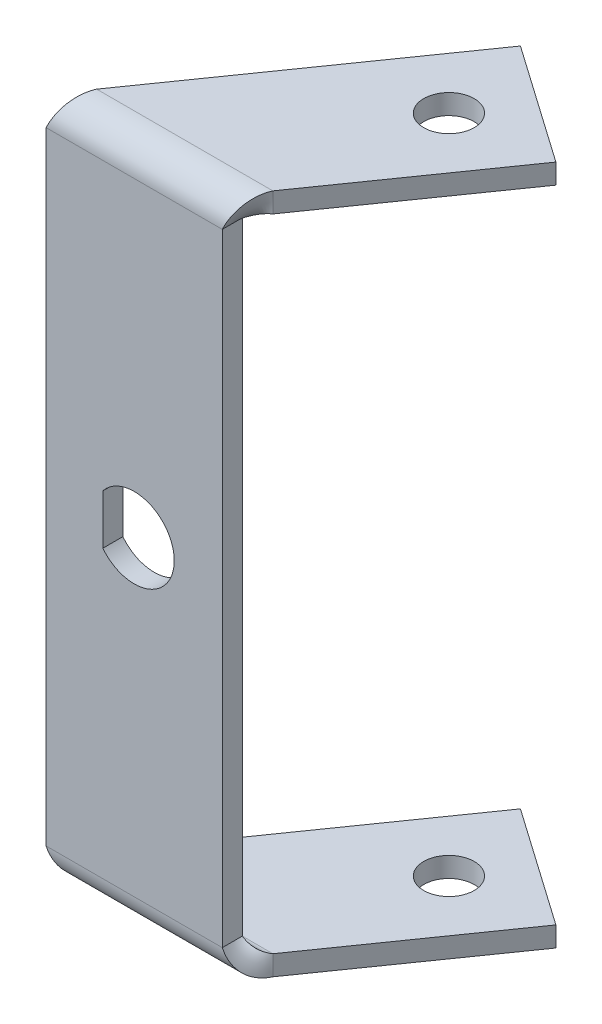
ISO-10303-21;
HEADER;
FILE_DESCRIPTION(('STEP AP214'),'2;1');
FILE_NAME('part.step','',(''),(''),'','','');
FILE_SCHEMA(('AUTOMOTIVE_DESIGN { 1 0 10303 214 1 1 1 1 }'));
ENDSEC;
DATA;
#1=APPLICATION_CONTEXT('core data for automotive mechanical design processes');
#2=APPLICATION_PROTOCOL_DEFINITION('international standard','automotive_design',2000,#1);
#3=PRODUCT_CONTEXT('',#1,'mechanical');
#4=PRODUCT('Part','Part','',(#3));
#5=PRODUCT_RELATED_PRODUCT_CATEGORY('part','',(#4));
#6=PRODUCT_DEFINITION_FORMATION('','',#4);
#7=PRODUCT_DEFINITION_CONTEXT('part definition',#1,'design');
#8=PRODUCT_DEFINITION('design','',#6,#7);
#9=PRODUCT_DEFINITION_SHAPE('','',#8);
#10=(LENGTH_UNIT() NAMED_UNIT(*) SI_UNIT(.MILLI.,.METRE.));
#11=(NAMED_UNIT(*) PLANE_ANGLE_UNIT() SI_UNIT($,.RADIAN.));
#12=(NAMED_UNIT(*) SI_UNIT($,.STERADIAN.) SOLID_ANGLE_UNIT());
#13=UNCERTAINTY_MEASURE_WITH_UNIT(LENGTH_MEASURE(1.E-05),#10,'distance_accuracy_value','');
#14=(GEOMETRIC_REPRESENTATION_CONTEXT(3) GLOBAL_UNCERTAINTY_ASSIGNED_CONTEXT((#13)) GLOBAL_UNIT_ASSIGNED_CONTEXT((#10,
#11,#12)) REPRESENTATION_CONTEXT('',''));
#15=CARTESIAN_POINT('',(0.,0.,0.));
#16=DIRECTION('',(0.,0.,1.));
#17=DIRECTION('',(1.,0.,0.));
#18=AXIS2_PLACEMENT_3D('',#15,#16,#17);
#19=CARTESIAN_POINT('',(0.,0.,-1.5875));
#20=DIRECTION('',(0.,0.,1.));
#21=DIRECTION('',(1.,0.,0.));
#22=AXIS2_PLACEMENT_3D('',#19,#20,#21);
#23=PLANE('',#22);
#24=DIRECTION('',(0.,-1.,0.));
#25=VECTOR('',#24,1.);
#26=CARTESIAN_POINT('',(-2.4892,-1.97091561463194,-1.5875));
#27=LINE('',#26,#25);
#28=CARTESIAN_POINT('',(-2.4892,1.97091561463194,-1.5875));
#29=VERTEX_POINT('',#28);
#30=CARTESIAN_POINT('',(-2.4892,-1.97091561463194,-1.5875));
#31=VERTEX_POINT('',#30);
#32=EDGE_CURVE('E441',#29,#31,#27,.T.);
#33=ORIENTED_EDGE('',*,*,#32,.T.);
#34=CARTESIAN_POINT('',(0.,0.,-1.5875));
#35=DIRECTION('',(0.,0.,1.));
#36=DIRECTION('',(1.,0.,0.));
#37=AXIS2_PLACEMENT_3D('',#34,#35,#36);
#38=CIRCLE('',#37,3.175);
#39=EDGE_CURVE('E432',#31,#29,#38,.T.);
#40=ORIENTED_EDGE('',*,*,#39,.T.);
#41=EDGE_LOOP('',(#33,#40));
#42=FACE_BOUND('',#41,.T.);
#43=DIRECTION('',(0.,1.,0.));
#44=VECTOR('',#43,1.);
#45=CARTESIAN_POINT('',(6.985,24.6634,-1.5875));
#46=LINE('',#45,#44);
#47=CARTESIAN_POINT('',(6.985,-24.6634,-1.5875));
#48=VERTEX_POINT('',#47);
#49=CARTESIAN_POINT('',(6.985,24.6634,-1.5875));
#50=VERTEX_POINT('',#49);
#51=EDGE_CURVE('E440',#48,#50,#46,.T.);
#52=ORIENTED_EDGE('',*,*,#51,.F.);
#53=DIRECTION('',(-1.,0.,0.));
#54=VECTOR('',#53,1.);
#55=CARTESIAN_POINT('',(0.,-24.6634,-1.5875));
#56=LINE('',#55,#54);
#57=CARTESIAN_POINT('',(-6.985,-24.6634,-1.5875));
#58=VERTEX_POINT('',#57);
#59=EDGE_CURVE('E578',#48,#58,#56,.T.);
#60=ORIENTED_EDGE('',*,*,#59,.T.);
#61=DIRECTION('',(0.,-1.,0.));
#62=VECTOR('',#61,1.);
#63=CARTESIAN_POINT('',(-6.985,24.6634,-1.5875));
#64=LINE('',#63,#62);
#65=CARTESIAN_POINT('',(-6.985,24.6634,-1.5875));
#66=VERTEX_POINT('',#65);
#67=EDGE_CURVE('E663',#66,#58,#64,.T.);
#68=ORIENTED_EDGE('',*,*,#67,.F.);
#69=DIRECTION('',(-1.,0.,0.));
#70=VECTOR('',#69,1.);
#71=CARTESIAN_POINT('',(0.,24.6634,-1.5875));
#72=LINE('',#71,#70);
#73=EDGE_CURVE('E474',#50,#66,#72,.T.);
#74=ORIENTED_EDGE('',*,*,#73,.F.);
#75=EDGE_LOOP('',(#52,#60,#68,#74));
#76=FACE_BOUND('',#75,.T.);
#77=ADVANCED_FACE('F73',(#42,#76),#23,.F.);
#78=CARTESIAN_POINT('',(0.,25.4000000000001,24.7431681587106));
#79=DIRECTION('',(0.,1.,0.));
#80=DIRECTION('',(1.,0.,0.));
#81=AXIS2_PLACEMENT_3D('',#78,#79,#80);
#82=PLANE('',#81);
#83=CARTESIAN_POINT('',(10.3108574652591,25.4,-14.6456623781015));
#84=DIRECTION('',(0.,1.,0.));
#85=DIRECTION('',(1.,0.,0.));
#86=AXIS2_PLACEMENT_3D('',#83,#84,#85);
#87=CIRCLE('',#86,2.);
#88=CARTESIAN_POINT('',(12.3108574652591,25.4,-14.6456623781015));
#89=VERTEX_POINT('',#88);
#90=EDGE_CURVE('E613',#89,#89,#87,.T.);
#91=ORIENTED_EDGE('',*,*,#90,.T.);
#92=EDGE_LOOP('',(#91));
#93=FACE_BOUND('',#92,.T.);
#94=DIRECTION('',(0.573576436351042,0.,-0.819152044288995));
#95=VECTOR('',#94,1.);
#96=CARTESIAN_POINT('',(6.985,25.4,0.0797681587105803));
#97=LINE('',#96,#95);
#98=CARTESIAN_POINT('',(8.66820660559142,25.4,-2.32410000000001));
#99=VERTEX_POINT('',#98);
#100=CARTESIAN_POINT('',(17.9116311124873,25.4,-15.5250782849948));
#101=VERTEX_POINT('',#100);
#102=EDGE_CURVE('E602',#99,#101,#97,.T.);
#103=ORIENTED_EDGE('',*,*,#102,.F.);
#104=DIRECTION('',(-1.,0.,0.));
#105=VECTOR('',#104,1.);
#106=CARTESIAN_POINT('',(0.,25.4,-2.3241));
#107=LINE('',#106,#105);
#108=CARTESIAN_POINT('',(-5.30179339440858,25.4,-2.3241));
#109=VERTEX_POINT('',#108);
#110=EDGE_CURVE('E593',#99,#109,#107,.T.);
#111=ORIENTED_EDGE('',*,*,#110,.T.);
#112=DIRECTION('',(-0.573576436351041,0.,0.819152044288995));
#113=VECTOR('',#112,1.);
#114=CARTESIAN_POINT('',(8.53762041135746,25.3999999999999,-22.0888312411843));
#115=LINE('',#114,#113);
#116=CARTESIAN_POINT('',(8.53762041135746,25.3999999999999,-22.0888312411843));
#117=VERTEX_POINT('',#116);
#118=EDGE_CURVE('E622',#117,#109,#115,.T.);
#119=ORIENTED_EDGE('',*,*,#118,.F.);
#120=DIRECTION('',(-0.819152044288995,0.,-0.573576436351042));
#121=VECTOR('',#120,1.);
#122=CARTESIAN_POINT('',(17.9116311124873,25.4,-15.5250782849948));
#123=LINE('',#122,#121);
#124=EDGE_CURVE('E608',#101,#117,#123,.T.);
#125=ORIENTED_EDGE('',*,*,#124,.F.);
#126=EDGE_LOOP('',(#103,#111,#119,#125));
#127=FACE_BOUND('',#126,.T.);
#128=ADVANCED_FACE('F539',(#93,#127),#82,.F.);
#129=CARTESIAN_POINT('',(8.53762041135746,25.3999999999999,-22.0888312411843));
#130=DIRECTION('',(-0.819152044288995,0.,-0.573576436351041));
#131=DIRECTION('',(-0.573576436351041,0.,0.819152044288995));
#132=AXIS2_PLACEMENT_3D('',#129,#130,#131);
#133=PLANE('',#132);
#134=CARTESIAN_POINT('',(-5.30179339440858,26.9875,-2.32410000000001));
#135=CARTESIAN_POINT('',(-5.30179339440858,25.4,-2.3241));
#136=B_SPLINE_CURVE_WITH_KNOTS('',1,(#134,#135),.UNSPECIFIED.,.F.,.F.,(2,2),(0.,1.),.UNSPECIFIED.);
#137=CARTESIAN_POINT('',(-5.30179339440858,26.9875,-2.32410000000002));
#138=VERTEX_POINT('',#137);
#139=EDGE_CURVE('E585',#138,#109,#136,.T.);
#140=ORIENTED_EDGE('',*,*,#139,.F.);
#141=DIRECTION('',(-0.573576436351041,0.,0.819152044288995));
#142=VECTOR('',#141,1.);
#143=CARTESIAN_POINT('',(8.53762041135746,26.9874999999999,-22.0888312411843));
#144=LINE('',#143,#142);
#145=CARTESIAN_POINT('',(8.53762041135746,26.9874999999999,-22.0888312411843));
#146=VERTEX_POINT('',#145);
#147=EDGE_CURVE('E600',#146,#138,#144,.T.);
#148=ORIENTED_EDGE('',*,*,#147,.F.);
#149=DIRECTION('',(0.,1.,0.));
#150=VECTOR('',#149,1.);
#151=CARTESIAN_POINT('',(8.53762041135746,25.3999999999999,-22.0888312411843));
#152=LINE('',#151,#150);
#153=EDGE_CURVE('E617',#117,#146,#152,.T.);
#154=ORIENTED_EDGE('',*,*,#153,.F.);
#155=ORIENTED_EDGE('',*,*,#118,.T.);
#156=EDGE_LOOP('',(#140,#148,#154,#155));
#157=FACE_BOUND('',#156,.T.);
#158=ADVANCED_FACE('F544',(#157),#133,.T.);
#159=CARTESIAN_POINT('',(17.9116311124873,25.4,-15.5250782849948));
#160=DIRECTION('',(0.573576436351042,0.,-0.819152044288995));
#161=DIRECTION('',(-0.819152044288995,0.,-0.573576436351042));
#162=AXIS2_PLACEMENT_3D('',#159,#160,#161);
#163=PLANE('',#162);
#164=DIRECTION('',(-0.819152044288995,0.,-0.573576436351042));
#165=VECTOR('',#164,1.);
#166=CARTESIAN_POINT('',(17.9116311124873,26.9875,-15.5250782849948));
#167=LINE('',#166,#165);
#168=CARTESIAN_POINT('',(17.9116311124873,26.9875,-15.5250782849948));
#169=VERTEX_POINT('',#168);
#170=EDGE_CURVE('E603',#169,#146,#167,.T.);
#171=ORIENTED_EDGE('',*,*,#170,.F.);
#172=DIRECTION('',(0.,1.,0.));
#173=VECTOR('',#172,1.);
#174=CARTESIAN_POINT('',(17.9116311124873,25.4,-15.5250782849948));
#175=LINE('',#174,#173);
#176=EDGE_CURVE('E619',#101,#169,#175,.T.);
#177=ORIENTED_EDGE('',*,*,#176,.F.);
#178=ORIENTED_EDGE('',*,*,#124,.T.);
#179=ORIENTED_EDGE('',*,*,#153,.T.);
#180=EDGE_LOOP('',(#171,#177,#178,#179));
#181=FACE_BOUND('',#180,.T.);
#182=ADVANCED_FACE('F552',(#181),#163,.T.);
#183=CARTESIAN_POINT('',(6.985,25.4,0.0797681587105803));
#184=DIRECTION('',(0.819152044288995,0.,0.573576436351042));
#185=DIRECTION('',(0.573576436351042,0.,-0.819152044288995));
#186=AXIS2_PLACEMENT_3D('',#183,#184,#185);
#187=PLANE('',#186);
#188=CARTESIAN_POINT('',(8.66820660559142,25.4,-2.32410000000001));
#189=CARTESIAN_POINT('',(8.66820660559142,26.9875,-2.32410000000002));
#190=B_SPLINE_CURVE_WITH_KNOTS('',1,(#188,#189),.UNSPECIFIED.,.F.,.F.,(2,2),(0.,1.),.UNSPECIFIED.);
#191=CARTESIAN_POINT('',(8.66820660559142,26.9875,-2.32410000000002));
#192=VERTEX_POINT('',#191);
#193=EDGE_CURVE('E590',#99,#192,#190,.T.);
#194=ORIENTED_EDGE('',*,*,#193,.F.);
#195=ORIENTED_EDGE('',*,*,#102,.T.);
#196=ORIENTED_EDGE('',*,*,#176,.T.);
#197=DIRECTION('',(0.573576436351042,0.,-0.819152044288995));
#198=VECTOR('',#197,1.);
#199=CARTESIAN_POINT('',(6.985,26.9875,0.0797681587105734));
#200=LINE('',#199,#198);
#201=EDGE_CURVE('E610',#192,#169,#200,.T.);
#202=ORIENTED_EDGE('',*,*,#201,.F.);
#203=EDGE_LOOP('',(#194,#195,#196,#202));
#204=FACE_BOUND('',#203,.T.);
#205=ADVANCED_FACE('F637',(#204),#187,.T.);
#206=CARTESIAN_POINT('',(0.,26.9875000000001,24.7431681587106));
#207=DIRECTION('',(0.,1.,0.));
#208=DIRECTION('',(1.,0.,0.));
#209=AXIS2_PLACEMENT_3D('',#206,#207,#208);
#210=PLANE('',#209);
#211=DIRECTION('',(-1.,0.,0.));
#212=VECTOR('',#211,1.);
#213=CARTESIAN_POINT('',(0.,26.9875,-2.3241));
#214=LINE('',#213,#212);
#215=EDGE_CURVE('E588',#192,#138,#214,.T.);
#216=ORIENTED_EDGE('',*,*,#215,.F.);
#217=ORIENTED_EDGE('',*,*,#201,.T.);
#218=ORIENTED_EDGE('',*,*,#170,.T.);
#219=ORIENTED_EDGE('',*,*,#147,.T.);
#220=EDGE_LOOP('',(#216,#217,#218,#219));
#221=FACE_BOUND('',#220,.T.);
#222=CARTESIAN_POINT('',(10.3108574652591,26.9875,-14.6456623781015));
#223=DIRECTION('',(0.,1.,0.));
#224=DIRECTION('',(1.,0.,0.));
#225=AXIS2_PLACEMENT_3D('',#222,#223,#224);
#226=CIRCLE('',#225,2.);
#227=CARTESIAN_POINT('',(12.3108574652591,26.9875,-14.6456623781015));
#228=VERTEX_POINT('',#227);
#229=EDGE_CURVE('E661',#228,#228,#226,.T.);
#230=ORIENTED_EDGE('',*,*,#229,.F.);
#231=EDGE_LOOP('',(#230));
#232=FACE_BOUND('',#231,.T.);
#233=ADVANCED_FACE('F554',(#221,#232),#210,.T.);
#234=CARTESIAN_POINT('',(10.3108574652591,25.4,-14.6456623781015));
#235=DIRECTION('',(0.,1.,0.));
#236=DIRECTION('',(1.,0.,0.));
#237=AXIS2_PLACEMENT_3D('',#234,#235,#236);
#238=CYLINDRICAL_SURFACE('',#237,2.);
#239=ORIENTED_EDGE('',*,*,#90,.F.);
#240=EDGE_LOOP('',(#239));
#241=FACE_BOUND('',#240,.T.);
#242=ORIENTED_EDGE('',*,*,#229,.T.);
#243=EDGE_LOOP('',(#242));
#244=FACE_BOUND('',#243,.T.);
#245=ADVANCED_FACE('F648',(#241,#244),#238,.F.);
#246=CARTESIAN_POINT('',(0.,0.,-1.5875));
#247=DIRECTION('',(0.,0.,1.));
#248=DIRECTION('',(1.,0.,0.));
#249=AXIS2_PLACEMENT_3D('',#246,#247,#248);
#250=CYLINDRICAL_SURFACE('',#249,3.175);
#251=CARTESIAN_POINT('',(0.,0.,0.));
#252=DIRECTION('',(0.,0.,1.));
#253=DIRECTION('',(1.,0.,0.));
#254=AXIS2_PLACEMENT_3D('',#251,#252,#253);
#255=CIRCLE('',#254,3.175);
#256=CARTESIAN_POINT('',(-2.4892,-1.97091561463194,0.));
#257=VERTEX_POINT('',#256);
#258=CARTESIAN_POINT('',(-2.4892,1.97091561463194,0.));
#259=VERTEX_POINT('',#258);
#260=EDGE_CURVE('E452',#257,#259,#255,.T.);
#261=ORIENTED_EDGE('',*,*,#260,.T.);
#262=DIRECTION('',(0.,0.,1.));
#263=VECTOR('',#262,1.);
#264=CARTESIAN_POINT('',(-2.4892,1.97091561463194,-1.5875));
#265=LINE('',#264,#263);
#266=EDGE_CURVE('E444',#29,#259,#265,.T.);
#267=ORIENTED_EDGE('',*,*,#266,.F.);
#268=ORIENTED_EDGE('',*,*,#39,.F.);
#269=DIRECTION('',(0.,0.,1.));
#270=VECTOR('',#269,1.);
#271=CARTESIAN_POINT('',(-2.4892,-1.97091561463194,-1.5875));
#272=LINE('',#271,#270);
#273=EDGE_CURVE('E450',#31,#257,#272,.T.);
#274=ORIENTED_EDGE('',*,*,#273,.T.);
#275=EDGE_LOOP('',(#261,#267,#268,#274));
#276=FACE_BOUND('',#275,.T.);
#277=ADVANCED_FACE('F402',(#276),#250,.F.);
#278=CARTESIAN_POINT('',(-2.4892,-1.97091561463194,-1.5875));
#279=DIRECTION('',(-1.,0.,0.));
#280=DIRECTION('',(0.,0.,1.));
#281=AXIS2_PLACEMENT_3D('',#278,#279,#280);
#282=PLANE('',#281);
#283=DIRECTION('',(0.,-1.,0.));
#284=VECTOR('',#283,1.);
#285=CARTESIAN_POINT('',(-2.4892,-1.97091561463194,0.));
#286=LINE('',#285,#284);
#287=EDGE_CURVE('E447',#259,#257,#286,.T.);
#288=ORIENTED_EDGE('',*,*,#287,.T.);
#289=ORIENTED_EDGE('',*,*,#273,.F.);
#290=ORIENTED_EDGE('',*,*,#32,.F.);
#291=ORIENTED_EDGE('',*,*,#266,.T.);
#292=EDGE_LOOP('',(#288,#289,#290,#291));
#293=FACE_BOUND('',#292,.T.);
#294=ADVANCED_FACE('F485',(#293),#282,.F.);
#295=CARTESIAN_POINT('',(6.985,24.6634,-1.5875));
#296=DIRECTION('',(1.,0.,0.));
#297=DIRECTION('',(0.,1.,0.));
#298=AXIS2_PLACEMENT_3D('',#295,#296,#297);
#299=PLANE('',#298);
#300=DIRECTION('',(0.,1.,0.));
#301=VECTOR('',#300,1.);
#302=CARTESIAN_POINT('',(6.985,24.6634,0.));
#303=LINE('',#302,#301);
#304=CARTESIAN_POINT('',(6.985,-24.6634,0.));
#305=VERTEX_POINT('',#304);
#306=CARTESIAN_POINT('',(6.985,24.6634,0.));
#307=VERTEX_POINT('',#306);
#308=EDGE_CURVE('E458',#305,#307,#303,.T.);
#309=ORIENTED_EDGE('',*,*,#308,.F.);
#310=CARTESIAN_POINT('',(6.985,-24.6634,-1.5875));
#311=CARTESIAN_POINT('',(6.985,-24.6634,0.));
#312=B_SPLINE_CURVE_WITH_KNOTS('',1,(#310,#311),.UNSPECIFIED.,.F.,.F.,(2,2),(0.,1.),.UNSPECIFIED.);
#313=EDGE_CURVE('E315',#48,#305,#312,.T.);
#314=ORIENTED_EDGE('',*,*,#313,.F.);
#315=ORIENTED_EDGE('',*,*,#51,.T.);
#316=CARTESIAN_POINT('',(6.985,24.6634,0.));
#317=CARTESIAN_POINT('',(6.985,24.6634,-1.5875));
#318=B_SPLINE_CURVE_WITH_KNOTS('',1,(#316,#317),.UNSPECIFIED.,.F.,.F.,(2,2),(0.,1.),.UNSPECIFIED.);
#319=EDGE_CURVE('E463',#50,#307,#318,.F.);
#320=ORIENTED_EDGE('',*,*,#319,.T.);
#321=EDGE_LOOP('',(#309,#314,#315,#320));
#322=FACE_BOUND('',#321,.T.);
#323=ADVANCED_FACE('F476',(#322),#299,.T.);
#324=CARTESIAN_POINT('',(0.,0.,0.));
#325=DIRECTION('',(0.,0.,1.));
#326=DIRECTION('',(1.,0.,0.));
#327=AXIS2_PLACEMENT_3D('',#324,#325,#326);
#328=PLANE('',#327);
#329=DIRECTION('',(-1.,0.,0.));
#330=VECTOR('',#329,1.);
#331=CARTESIAN_POINT('',(0.,-24.6634,0.));
#332=LINE('',#331,#330);
#333=CARTESIAN_POINT('',(-6.985,-24.6634,0.));
#334=VERTEX_POINT('',#333);
#335=EDGE_CURVE('E84',#305,#334,#332,.T.);
#336=ORIENTED_EDGE('',*,*,#335,.F.);
#337=ORIENTED_EDGE('',*,*,#308,.T.);
#338=DIRECTION('',(-1.,0.,0.));
#339=VECTOR('',#338,1.);
#340=CARTESIAN_POINT('',(0.,24.6634,0.));
#341=LINE('',#340,#339);
#342=CARTESIAN_POINT('',(-6.985,24.6634,0.));
#343=VERTEX_POINT('',#342);
#344=EDGE_CURVE('E454',#307,#343,#341,.T.);
#345=ORIENTED_EDGE('',*,*,#344,.T.);
#346=DIRECTION('',(0.,-1.,0.));
#347=VECTOR('',#346,1.);
#348=CARTESIAN_POINT('',(-6.985,24.6634,0.));
#349=LINE('',#348,#347);
#350=EDGE_CURVE('E457',#343,#334,#349,.T.);
#351=ORIENTED_EDGE('',*,*,#350,.T.);
#352=EDGE_LOOP('',(#336,#337,#345,#351));
#353=FACE_BOUND('',#352,.T.);
#354=ORIENTED_EDGE('',*,*,#260,.F.);
#355=ORIENTED_EDGE('',*,*,#287,.F.);
#356=EDGE_LOOP('',(#354,#355));
#357=FACE_BOUND('',#356,.T.);
#358=ADVANCED_FACE('F75',(#353,#357),#328,.T.);
#359=CARTESIAN_POINT('',(-6.985,24.6634,-1.5875));
#360=DIRECTION('',(-1.,0.,0.));
#361=DIRECTION('',(0.,-1.,0.));
#362=AXIS2_PLACEMENT_3D('',#359,#360,#361);
#363=PLANE('',#362);
#364=ORIENTED_EDGE('',*,*,#350,.F.);
#365=CARTESIAN_POINT('',(-6.985,24.6634,-1.5875));
#366=CARTESIAN_POINT('',(-6.985,24.6634,0.));
#367=B_SPLINE_CURVE_WITH_KNOTS('',1,(#365,#366),.UNSPECIFIED.,.F.,.F.,(2,2),(0.,1.),.UNSPECIFIED.);
#368=EDGE_CURVE('E428',#66,#343,#367,.T.);
#369=ORIENTED_EDGE('',*,*,#368,.F.);
#370=ORIENTED_EDGE('',*,*,#67,.T.);
#371=CARTESIAN_POINT('',(-6.985,-24.6634,0.));
#372=CARTESIAN_POINT('',(-6.985,-24.6634,-1.5875));
#373=B_SPLINE_CURVE_WITH_KNOTS('',1,(#371,#372),.UNSPECIFIED.,.F.,.F.,(2,2),(0.,1.),.UNSPECIFIED.);
#374=EDGE_CURVE('E12',#58,#334,#373,.F.);
#375=ORIENTED_EDGE('',*,*,#374,.T.);
#376=EDGE_LOOP('',(#364,#369,#370,#375));
#377=FACE_BOUND('',#376,.T.);
#378=ADVANCED_FACE('F486',(#377),#363,.T.);
#379=CARTESIAN_POINT('',(8.66820660559142,26.9875,-2.32410000000002));
#380=CARTESIAN_POINT('',(8.52791853229599,26.9875,-2.0198307867127));
#381=CARTESIAN_POINT('',(8.38767217132618,26.9270098978449,-1.71577174196061));
#382=CARTESIAN_POINT('',(8.10713773706095,26.6941669451741,-1.15363912771999));
#383=CARTESIAN_POINT('',(7.96687051992833,26.5219057084176,-0.895831968106298));
#384=CARTESIAN_POINT('',(7.68633608566309,26.0916680318937,-0.465594291582382));
#385=CARTESIAN_POINT('',(7.54606886853047,25.83386087228,-0.293333054825862));
#386=CARTESIAN_POINT('',(7.26553443426524,25.2717282580394,-0.0604901021551614));
#387=CARTESIAN_POINT('',(7.12528807329544,24.9676692132873,0.));
#388=CARTESIAN_POINT('',(6.985,24.6634,0.));
#389=CARTESIAN_POINT('',(8.66820660559142,25.4,-2.32410000000001));
#390=CARTESIAN_POINT('',(8.52793127306002,25.4,-2.22767370688889));
#391=CARTESIAN_POINT('',(8.38767217132618,25.3808282736339,-2.13129650838096));
#392=CARTESIAN_POINT('',(8.10713773706095,25.3070310536618,-1.9531342590588));
#393=CARTESIAN_POINT('',(7.96687051992833,25.2524345961105,-1.87142488606648));
#394=CARTESIAN_POINT('',(7.68633608566309,25.1160751139335,-1.7350654038895));
#395=CARTESIAN_POINT('',(7.54606886853047,25.0343657409412,-1.68046894633825));
#396=CARTESIAN_POINT('',(7.26553443426524,24.8562034916191,-1.60667172636612));
#397=CARTESIAN_POINT('',(7.1252753325314,24.7598262931111,-1.5875));
#398=CARTESIAN_POINT('',(6.985,24.6634,-1.5875));
#399=B_SPLINE_SURFACE_WITH_KNOTS('',1,3,((#379,#380,#381,#382,#383,#384,#385,#386,#387,#388),
(#389,#390,#391,#392,#393,#394,#395,#396,#397,#398)),.UNSPECIFIED.,.F.,.F.,.F.,(2,2),(4,2,2,2,
4),(0.,1.),(0.,0.25,0.5,0.75,1.),.UNSPECIFIED.);
#400=CARTESIAN_POINT('',(8.66820660559142,26.9875,-2.32410000000002));
#401=CARTESIAN_POINT('',(8.52791853229599,26.9875,-2.0198307867127));
#402=CARTESIAN_POINT('',(8.38767217132618,26.9270098978449,-1.71577174196061));
#403=CARTESIAN_POINT('',(8.10713773706095,26.6941669451741,-1.15363912771999));
#404=CARTESIAN_POINT('',(7.96687051992833,26.5219057084176,-0.895831968106298));
#405=CARTESIAN_POINT('',(7.68633608566309,26.0916680318937,-0.465594291582382));
#406=CARTESIAN_POINT('',(7.54606886853047,25.83386087228,-0.293333054825862));
#407=CARTESIAN_POINT('',(7.26553443426524,25.2717282580394,-0.0604901021551614));
#408=CARTESIAN_POINT('',(7.12528807329544,24.9676692132873,0.));
#409=CARTESIAN_POINT('',(6.985,24.6634,0.));
#410=B_SPLINE_CURVE_WITH_KNOTS('',3,(#400,#401,#402,#403,#404,#405,#406,#407,#408,#409),
.UNSPECIFIED.,.F.,.F.,(4,2,2,2,4),(0.,0.25,0.5,0.75,1.),.UNSPECIFIED.);
#411=EDGE_CURVE('E352',#192,#307,#410,.T.);
#412=CARTESIAN_POINT('',(6.985,24.6634,-1.5875));
#413=CARTESIAN_POINT('',(7.1252753325314,24.7598262931111,-1.5875));
#414=CARTESIAN_POINT('',(7.26553443426524,24.8562034916191,-1.60667172636612));
#415=CARTESIAN_POINT('',(7.54606886853047,25.0343657409412,-1.68046894633825));
#416=CARTESIAN_POINT('',(7.68633608566309,25.1160751139335,-1.7350654038895));
#417=CARTESIAN_POINT('',(7.96687051992833,25.2524345961105,-1.87142488606648));
#418=CARTESIAN_POINT('',(8.10713773706095,25.3070310536618,-1.9531342590588));
#419=CARTESIAN_POINT('',(8.38767217132618,25.3808282736339,-2.13129650838096));
#420=CARTESIAN_POINT('',(8.52793127306002,25.4,-2.22767370688889));
#421=CARTESIAN_POINT('',(8.66820660559142,25.4,-2.32410000000001));
#422=B_SPLINE_CURVE_WITH_KNOTS('',3,(#412,#413,#414,#415,#416,#417,#418,#419,#420,#421),
.UNSPECIFIED.,.F.,.F.,(4,2,2,2,4),(0.,0.25,0.5,0.75,1.),.UNSPECIFIED.);
#423=EDGE_CURVE('E346',#99,#50,#422,.F.);
#424=ORIENTED_EDGE('',*,*,#193,.T.);
#425=ORIENTED_EDGE('',*,*,#411,.T.);
#426=ORIENTED_EDGE('',*,*,#319,.F.);
#427=ORIENTED_EDGE('',*,*,#423,.F.);
#428=EDGE_LOOP('',(#424,#425,#426,#427));
#429=FACE_BOUND('',#428,.T.);
#430=ADVANCED_FACE('F366',(#429),#399,.F.);
#431=CARTESIAN_POINT('',(-6.985,24.6634,0.));
#432=CARTESIAN_POINT('',(-6.84471192670456,24.9676692132873,0.));
#433=CARTESIAN_POINT('',(-6.70446556573477,25.2717282580394,-0.0604901021551593));
#434=CARTESIAN_POINT('',(-6.42393113146953,25.83386087228,-0.293333054825857));
#435=CARTESIAN_POINT('',(-6.28366391433691,26.0916680318937,-0.465594291582381));
#436=CARTESIAN_POINT('',(-6.00312948007168,26.5219057084176,-0.895831968106294));
#437=CARTESIAN_POINT('',(-5.86286226293906,26.6941669451741,-1.15363912771999));
#438=CARTESIAN_POINT('',(-5.58232782867382,26.9270098978449,-1.7157717419606));
#439=CARTESIAN_POINT('',(-5.44208146770402,26.9875,-2.01983078671268));
#440=CARTESIAN_POINT('',(-5.30179339440858,26.9875,-2.32410000000001));
#441=CARTESIAN_POINT('',(-6.985,24.6634,-1.5875));
#442=CARTESIAN_POINT('',(-6.8447246674686,24.7598262931111,-1.5875));
#443=CARTESIAN_POINT('',(-6.70446556573477,24.8562034916191,-1.60667172636612));
#444=CARTESIAN_POINT('',(-6.42393113146953,25.0343657409412,-1.68046894633825));
#445=CARTESIAN_POINT('',(-6.28366391433691,25.1160751139335,-1.7350654038895));
#446=CARTESIAN_POINT('',(-6.00312948007168,25.2524345961105,-1.87142488606648));
#447=CARTESIAN_POINT('',(-5.86286226293906,25.3070310536618,-1.95313425905879));
#448=CARTESIAN_POINT('',(-5.58232782867382,25.3808282736339,-2.13129650838095));
#449=CARTESIAN_POINT('',(-5.44206872693999,25.4,-2.22767370688889));
#450=CARTESIAN_POINT('',(-5.30179339440858,25.4,-2.3241));
#451=B_SPLINE_SURFACE_WITH_KNOTS('',1,3,((#431,#432,#433,#434,#435,#436,#437,#438,#439,#440),
(#441,#442,#443,#444,#445,#446,#447,#448,#449,#450)),.UNSPECIFIED.,.F.,.F.,.F.,(2,2),(4,2,2,2,
4),(0.,1.),(0.,0.25,0.5,0.75,1.),.UNSPECIFIED.);
#452=CARTESIAN_POINT('',(-6.985,24.6634,0.));
#453=CARTESIAN_POINT('',(-6.84471192670456,24.9676692132873,0.));
#454=CARTESIAN_POINT('',(-6.70446556573477,25.2717282580394,-0.0604901021551593));
#455=CARTESIAN_POINT('',(-6.42393113146953,25.83386087228,-0.293333054825857));
#456=CARTESIAN_POINT('',(-6.28366391433691,26.0916680318937,-0.465594291582381));
#457=CARTESIAN_POINT('',(-6.00312948007168,26.5219057084176,-0.895831968106294));
#458=CARTESIAN_POINT('',(-5.86286226293906,26.6941669451741,-1.15363912771999));
#459=CARTESIAN_POINT('',(-5.58232782867382,26.9270098978449,-1.7157717419606));
#460=CARTESIAN_POINT('',(-5.44208146770402,26.9875,-2.01983078671268));
#461=CARTESIAN_POINT('',(-5.30179339440858,26.9875,-2.32410000000001));
#462=B_SPLINE_CURVE_WITH_KNOTS('',3,(#452,#453,#454,#455,#456,#457,#458,#459,#460,#461),
.UNSPECIFIED.,.F.,.F.,(4,2,2,2,4),(0.,0.25,0.5,0.75,1.),.UNSPECIFIED.);
#463=EDGE_CURVE('E688',#343,#138,#462,.T.);
#464=CARTESIAN_POINT('',(-5.30179339440858,25.4,-2.3241));
#465=CARTESIAN_POINT('',(-5.44206872693999,25.4,-2.22767370688889));
#466=CARTESIAN_POINT('',(-5.58232782867382,25.3808282736339,-2.13129650838095));
#467=CARTESIAN_POINT('',(-5.86286226293906,25.3070310536618,-1.95313425905879));
#468=CARTESIAN_POINT('',(-6.00312948007168,25.2524345961105,-1.87142488606648));
#469=CARTESIAN_POINT('',(-6.28366391433691,25.1160751139335,-1.7350654038895));
#470=CARTESIAN_POINT('',(-6.42393113146953,25.0343657409412,-1.68046894633825));
#471=CARTESIAN_POINT('',(-6.70446556573477,24.8562034916191,-1.60667172636612));
#472=CARTESIAN_POINT('',(-6.8447246674686,24.7598262931111,-1.5875));
#473=CARTESIAN_POINT('',(-6.985,24.6634,-1.5875));
#474=B_SPLINE_CURVE_WITH_KNOTS('',3,(#464,#465,#466,#467,#468,#469,#470,#471,#472,#473),
.UNSPECIFIED.,.F.,.F.,(4,2,2,2,4),(0.,0.25,0.5,0.75,1.),.UNSPECIFIED.);
#475=EDGE_CURVE('E98',#66,#109,#474,.F.);
#476=ORIENTED_EDGE('',*,*,#463,.T.);
#477=ORIENTED_EDGE('',*,*,#139,.T.);
#478=ORIENTED_EDGE('',*,*,#475,.F.);
#479=ORIENTED_EDGE('',*,*,#368,.T.);
#480=EDGE_LOOP('',(#476,#477,#478,#479));
#481=FACE_BOUND('',#480,.T.);
#482=ADVANCED_FACE('F391',(#481),#451,.F.);
#483=CARTESIAN_POINT('',(-15.9160804035351,24.6634,-2.3241));
#484=DIRECTION('',(1.,0.,0.));
#485=DIRECTION('',(0.,0.,-1.));
#486=AXIS2_PLACEMENT_3D('',#483,#484,#485);
#487=CYLINDRICAL_SURFACE('',#486,0.7366);
#488=ORIENTED_EDGE('',*,*,#73,.T.);
#489=ORIENTED_EDGE('',*,*,#475,.T.);
#490=ORIENTED_EDGE('',*,*,#110,.F.);
#491=ORIENTED_EDGE('',*,*,#423,.T.);
#492=EDGE_LOOP('',(#488,#489,#490,#491));
#493=FACE_BOUND('',#492,.T.);
#494=ADVANCED_FACE('F288',(#493),#487,.F.);
#495=CARTESIAN_POINT('',(-15.9160804035351,24.6634,-2.3241));
#496=DIRECTION('',(1.,0.,0.));
#497=DIRECTION('',(0.,0.,-1.));
#498=AXIS2_PLACEMENT_3D('',#495,#496,#497);
#499=CYLINDRICAL_SURFACE('',#498,2.3241);
#500=ORIENTED_EDGE('',*,*,#344,.F.);
#501=ORIENTED_EDGE('',*,*,#411,.F.);
#502=ORIENTED_EDGE('',*,*,#215,.T.);
#503=ORIENTED_EDGE('',*,*,#463,.F.);
#504=EDGE_LOOP('',(#500,#501,#502,#503));
#505=FACE_BOUND('',#504,.T.);
#506=ADVANCED_FACE('F284',(#505),#499,.T.);
#507=CARTESIAN_POINT('',(6.985,-24.6634,0.));
#508=CARTESIAN_POINT('',(7.12528807329544,-24.9676692132873,0.));
#509=CARTESIAN_POINT('',(7.26553443426524,-25.2717282580394,-0.0604901021551759));
#510=CARTESIAN_POINT('',(7.54606886853048,-25.83386087228,-0.293333054825882));
#511=CARTESIAN_POINT('',(7.6863360856631,-26.0916680318937,-0.465594291582403));
#512=CARTESIAN_POINT('',(7.96687051992833,-26.5219057084176,-0.895831968106313));
#513=CARTESIAN_POINT('',(8.10713773706095,-26.6941669451741,-1.15363912772));
#514=CARTESIAN_POINT('',(8.38767217132619,-26.9270098978448,-1.7157717419606));
#515=CARTESIAN_POINT('',(8.52791853229599,-26.9875,-2.01983078671268));
#516=CARTESIAN_POINT('',(8.66820660559142,-26.9875,-2.3241));
#517=CARTESIAN_POINT('',(6.985,-24.6634,-1.5875));
#518=CARTESIAN_POINT('',(7.12527533253141,-24.7598262931111,-1.5875));
#519=CARTESIAN_POINT('',(7.26553443426524,-24.856203491619,-1.60667172636612));
#520=CARTESIAN_POINT('',(7.54606886853048,-25.0343657409412,-1.68046894633826));
#521=CARTESIAN_POINT('',(7.6863360856631,-25.1160751139335,-1.73506540388951));
#522=CARTESIAN_POINT('',(7.96687051992833,-25.2524345961105,-1.87142488606648));
#523=CARTESIAN_POINT('',(8.10713773706095,-25.3070310536617,-1.9531342590588));
#524=CARTESIAN_POINT('',(8.38767217132619,-25.3808282736339,-2.13129650838096));
#525=CARTESIAN_POINT('',(8.52793127306002,-25.4,-2.22767370688889));
#526=CARTESIAN_POINT('',(8.66820660559142,-25.4,-2.3241));
#527=B_SPLINE_SURFACE_WITH_KNOTS('',1,3,((#507,#508,#509,#510,#511,#512,#513,#514,#515,#516),
(#517,#518,#519,#520,#521,#522,#523,#524,#525,#526)),.UNSPECIFIED.,.F.,.F.,.F.,(2,2),(4,2,2,2,
4),(0.,1.),(0.,0.25,0.5,0.75,1.),.UNSPECIFIED.);
#528=CARTESIAN_POINT('',(6.985,-24.6634,0.));
#529=CARTESIAN_POINT('',(7.12528807329544,-24.9676692132873,0.));
#530=CARTESIAN_POINT('',(7.26553443426524,-25.2717282580394,-0.0604901021551759));
#531=CARTESIAN_POINT('',(7.54606886853048,-25.83386087228,-0.293333054825882));
#532=CARTESIAN_POINT('',(7.6863360856631,-26.0916680318937,-0.465594291582403));
#533=CARTESIAN_POINT('',(7.96687051992833,-26.5219057084176,-0.895831968106313));
#534=CARTESIAN_POINT('',(8.10713773706095,-26.6941669451741,-1.15363912772));
#535=CARTESIAN_POINT('',(8.38767217132619,-26.9270098978448,-1.7157717419606));
#536=CARTESIAN_POINT('',(8.52791853229599,-26.9875,-2.01983078671268));
#537=CARTESIAN_POINT('',(8.66820660559142,-26.9875,-2.3241));
#538=B_SPLINE_CURVE_WITH_KNOTS('',3,(#528,#529,#530,#531,#532,#533,#534,#535,#536,#537),
.UNSPECIFIED.,.F.,.F.,(4,2,2,2,4),(0.,0.25,0.5,0.75,1.),.UNSPECIFIED.);
#539=CARTESIAN_POINT('',(8.66820660559142,-26.9875,-2.32410000000001));
#540=VERTEX_POINT('',#539);
#541=EDGE_CURVE('E196',#305,#540,#538,.T.);
#542=CARTESIAN_POINT('',(8.66820660559142,-26.9875,-2.3241));
#543=CARTESIAN_POINT('',(8.66820660559142,-25.4,-2.3241));
#544=B_SPLINE_CURVE_WITH_KNOTS('',1,(#542,#543),.UNSPECIFIED.,.F.,.F.,(2,2),(0.,1.),.UNSPECIFIED.);
#545=CARTESIAN_POINT('',(8.66820660559142,-25.4,-2.3241));
#546=VERTEX_POINT('',#545);
#547=EDGE_CURVE('E507',#546,#540,#544,.F.);
#548=CARTESIAN_POINT('',(8.66820660559142,-25.4,-2.3241));
#549=CARTESIAN_POINT('',(8.52793127306002,-25.4,-2.22767370688889));
#550=CARTESIAN_POINT('',(8.38767217132619,-25.3808282736339,-2.13129650838096));
#551=CARTESIAN_POINT('',(8.10713773706095,-25.3070310536617,-1.9531342590588));
#552=CARTESIAN_POINT('',(7.96687051992833,-25.2524345961105,-1.87142488606648));
#553=CARTESIAN_POINT('',(7.6863360856631,-25.1160751139335,-1.73506540388951));
#554=CARTESIAN_POINT('',(7.54606886853048,-25.0343657409412,-1.68046894633826));
#555=CARTESIAN_POINT('',(7.26553443426524,-24.856203491619,-1.60667172636612));
#556=CARTESIAN_POINT('',(7.12527533253141,-24.7598262931111,-1.5875));
#557=CARTESIAN_POINT('',(6.985,-24.6634,-1.5875));
#558=B_SPLINE_CURVE_WITH_KNOTS('',3,(#548,#549,#550,#551,#552,#553,#554,#555,#556,#557),
.UNSPECIFIED.,.F.,.F.,(4,2,2,2,4),(0.,0.25,0.5,0.75,1.),.UNSPECIFIED.);
#559=EDGE_CURVE('E252',#48,#546,#558,.F.);
#560=ORIENTED_EDGE('',*,*,#313,.T.);
#561=ORIENTED_EDGE('',*,*,#541,.T.);
#562=ORIENTED_EDGE('',*,*,#547,.F.);
#563=ORIENTED_EDGE('',*,*,#559,.F.);
#564=EDGE_LOOP('',(#560,#561,#562,#563));
#565=FACE_BOUND('',#564,.T.);
#566=ADVANCED_FACE('F273',(#565),#527,.F.);
#567=CARTESIAN_POINT('',(-5.30179339440858,-26.9875,-2.3241));
#568=CARTESIAN_POINT('',(-5.44208146770401,-26.9875,-2.01983078671268));
#569=CARTESIAN_POINT('',(-5.58232782867381,-26.9270098978448,-1.7157717419606));
#570=CARTESIAN_POINT('',(-5.86286226293905,-26.6941669451741,-1.15363912772001));
#571=CARTESIAN_POINT('',(-6.00312948007167,-26.5219057084176,-0.895831968106315));
#572=CARTESIAN_POINT('',(-6.28366391433691,-26.0916680318937,-0.465594291582406));
#573=CARTESIAN_POINT('',(-6.42393113146953,-25.83386087228,-0.293333054825887));
#574=CARTESIAN_POINT('',(-6.70446556573476,-25.2717282580394,-0.0604901021551793));
#575=CARTESIAN_POINT('',(-6.84471192670456,-24.9676692132873,0.));
#576=CARTESIAN_POINT('',(-6.985,-24.6634,0.));
#577=CARTESIAN_POINT('',(-5.30179339440858,-25.4,-2.3241));
#578=CARTESIAN_POINT('',(-5.44206872693998,-25.4,-2.22767370688889));
#579=CARTESIAN_POINT('',(-5.58232782867381,-25.3808282736339,-2.13129650838096));
#580=CARTESIAN_POINT('',(-5.86286226293905,-25.3070310536617,-1.9531342590588));
#581=CARTESIAN_POINT('',(-6.00312948007167,-25.2524345961105,-1.87142488606648));
#582=CARTESIAN_POINT('',(-6.28366391433691,-25.1160751139335,-1.73506540388951));
#583=CARTESIAN_POINT('',(-6.42393113146953,-25.0343657409412,-1.68046894633826));
#584=CARTESIAN_POINT('',(-6.70446556573476,-24.856203491619,-1.60667172636612));
#585=CARTESIAN_POINT('',(-6.84472466746859,-24.7598262931111,-1.5875));
#586=CARTESIAN_POINT('',(-6.985,-24.6634,-1.5875));
#587=B_SPLINE_SURFACE_WITH_KNOTS('',1,3,((#567,#568,#569,#570,#571,#572,#573,#574,#575,#576),
(#577,#578,#579,#580,#581,#582,#583,#584,#585,#586)),.UNSPECIFIED.,.F.,.F.,.F.,(2,2),(4,2,2,2,
4),(0.,1.),(0.,0.25,0.5,0.75,1.),.UNSPECIFIED.);
#588=CARTESIAN_POINT('',(-5.30179339440858,-25.4,-2.3241));
#589=CARTESIAN_POINT('',(-5.30179339440858,-26.9875,-2.3241));
#590=B_SPLINE_CURVE_WITH_KNOTS('',1,(#588,#589),.UNSPECIFIED.,.F.,.F.,(2,2),(0.,1.),.UNSPECIFIED.);
#591=CARTESIAN_POINT('',(-5.30179339440858,-26.9875,-2.32410000000001));
#592=VERTEX_POINT('',#591);
#593=CARTESIAN_POINT('',(-5.30179339440857,-25.4,-2.3241));
#594=VERTEX_POINT('',#593);
#595=EDGE_CURVE('E185',#592,#594,#590,.F.);
#596=CARTESIAN_POINT('',(-5.30179339440858,-26.9875,-2.3241));
#597=CARTESIAN_POINT('',(-5.44208146770401,-26.9875,-2.01983078671268));
#598=CARTESIAN_POINT('',(-5.58232782867381,-26.9270098978448,-1.7157717419606));
#599=CARTESIAN_POINT('',(-5.86286226293905,-26.6941669451741,-1.15363912772001));
#600=CARTESIAN_POINT('',(-6.00312948007167,-26.5219057084176,-0.895831968106315));
#601=CARTESIAN_POINT('',(-6.28366391433691,-26.0916680318937,-0.465594291582406));
#602=CARTESIAN_POINT('',(-6.42393113146953,-25.83386087228,-0.293333054825887));
#603=CARTESIAN_POINT('',(-6.70446556573476,-25.2717282580394,-0.0604901021551793));
#604=CARTESIAN_POINT('',(-6.84471192670456,-24.9676692132873,0.));
#605=CARTESIAN_POINT('',(-6.985,-24.6634,0.));
#606=B_SPLINE_CURVE_WITH_KNOTS('',3,(#596,#597,#598,#599,#600,#601,#602,#603,#604,#605),
.UNSPECIFIED.,.F.,.F.,(4,2,2,2,4),(0.,0.25,0.5,0.75,1.),.UNSPECIFIED.);
#607=EDGE_CURVE('E696',#592,#334,#606,.T.);
#608=CARTESIAN_POINT('',(-6.985,-24.6634,-1.5875));
#609=CARTESIAN_POINT('',(-6.84472466746859,-24.7598262931111,-1.5875));
#610=CARTESIAN_POINT('',(-6.70446556573476,-24.856203491619,-1.60667172636612));
#611=CARTESIAN_POINT('',(-6.42393113146953,-25.0343657409412,-1.68046894633826));
#612=CARTESIAN_POINT('',(-6.28366391433691,-25.1160751139335,-1.73506540388951));
#613=CARTESIAN_POINT('',(-6.00312948007167,-25.2524345961105,-1.87142488606648));
#614=CARTESIAN_POINT('',(-5.86286226293905,-25.3070310536617,-1.9531342590588));
#615=CARTESIAN_POINT('',(-5.58232782867381,-25.3808282736339,-2.13129650838096));
#616=CARTESIAN_POINT('',(-5.44206872693998,-25.4,-2.22767370688889));
#617=CARTESIAN_POINT('',(-5.30179339440858,-25.4,-2.3241));
#618=B_SPLINE_CURVE_WITH_KNOTS('',3,(#608,#609,#610,#611,#612,#613,#614,#615,#616,#617),
.UNSPECIFIED.,.F.,.F.,(4,2,2,2,4),(0.,0.25,0.5,0.75,1.),.UNSPECIFIED.);
#619=EDGE_CURVE('E691',#594,#58,#618,.F.);
#620=ORIENTED_EDGE('',*,*,#595,.F.);
#621=ORIENTED_EDGE('',*,*,#607,.T.);
#622=ORIENTED_EDGE('',*,*,#374,.F.);
#623=ORIENTED_EDGE('',*,*,#619,.F.);
#624=EDGE_LOOP('',(#620,#621,#622,#623));
#625=FACE_BOUND('',#624,.T.);
#626=ADVANCED_FACE('F229',(#625),#587,.F.);
#627=CARTESIAN_POINT('',(15.9160804035351,-24.6634,-2.3241));
#628=DIRECTION('',(-1.,0.,0.));
#629=DIRECTION('',(0.,-1.,0.));
#630=AXIS2_PLACEMENT_3D('',#627,#628,#629);
#631=CYLINDRICAL_SURFACE('',#630,0.7366);
#632=ORIENTED_EDGE('',*,*,#619,.T.);
#633=ORIENTED_EDGE('',*,*,#59,.F.);
#634=ORIENTED_EDGE('',*,*,#559,.T.);
#635=DIRECTION('',(-1.,0.,0.));
#636=VECTOR('',#635,1.);
#637=CARTESIAN_POINT('',(0.,-25.4,-2.3241));
#638=LINE('',#637,#636);
#639=EDGE_CURVE('E209',#546,#594,#638,.T.);
#640=ORIENTED_EDGE('',*,*,#639,.T.);
#641=EDGE_LOOP('',(#632,#633,#634,#640));
#642=FACE_BOUND('',#641,.T.);
#643=ADVANCED_FACE('F219',(#642),#631,.F.);
#644=CARTESIAN_POINT('',(15.9160804035351,-24.6634,-2.3241));
#645=DIRECTION('',(-1.,0.,0.));
#646=DIRECTION('',(0.,-1.,0.));
#647=AXIS2_PLACEMENT_3D('',#644,#645,#646);
#648=CYLINDRICAL_SURFACE('',#647,2.3241);
#649=ORIENTED_EDGE('',*,*,#607,.F.);
#650=DIRECTION('',(-1.,0.,0.));
#651=VECTOR('',#650,1.);
#652=CARTESIAN_POINT('',(0.,-26.9875,-2.32410000000002));
#653=LINE('',#652,#651);
#654=EDGE_CURVE('E518',#540,#592,#653,.T.);
#655=ORIENTED_EDGE('',*,*,#654,.F.);
#656=ORIENTED_EDGE('',*,*,#541,.F.);
#657=ORIENTED_EDGE('',*,*,#335,.T.);
#658=EDGE_LOOP('',(#649,#655,#656,#657));
#659=FACE_BOUND('',#658,.T.);
#660=ADVANCED_FACE('F228',(#659),#648,.T.);
#661=CARTESIAN_POINT('',(10.3108574652591,-25.3999999999999,-14.6456623781015));
#662=DIRECTION('',(0.,-1.,0.));
#663=DIRECTION('',(1.,0.,0.));
#664=AXIS2_PLACEMENT_3D('',#661,#662,#663);
#665=CYLINDRICAL_SURFACE('',#664,2.);
#666=CARTESIAN_POINT('',(10.3108574652591,-25.3999999999999,-14.6456623781015));
#667=DIRECTION('',(0.,-1.,0.));
#668=DIRECTION('',(1.,0.,0.));
#669=AXIS2_PLACEMENT_3D('',#666,#667,#668);
#670=CIRCLE('',#669,2.);
#671=CARTESIAN_POINT('',(12.3108574652591,-25.3999999999999,-14.6456623781015));
#672=VERTEX_POINT('',#671);
#673=EDGE_CURVE('E206',#672,#672,#670,.T.);
#674=ORIENTED_EDGE('',*,*,#673,.F.);
#675=EDGE_LOOP('',(#674));
#676=FACE_BOUND('',#675,.T.);
#677=CARTESIAN_POINT('',(10.3108574652591,-26.9874999999999,-14.6456623781015));
#678=DIRECTION('',(0.,-1.,0.));
#679=DIRECTION('',(1.,0.,0.));
#680=AXIS2_PLACEMENT_3D('',#677,#678,#679);
#681=CIRCLE('',#680,2.);
#682=CARTESIAN_POINT('',(12.3108574652591,-26.9874999999999,-14.6456623781015));
#683=VERTEX_POINT('',#682);
#684=EDGE_CURVE('E204',#683,#683,#681,.T.);
#685=ORIENTED_EDGE('',*,*,#684,.T.);
#686=EDGE_LOOP('',(#685));
#687=FACE_BOUND('',#686,.T.);
#688=ADVANCED_FACE('F712',(#676,#687),#665,.F.);
#689=CARTESIAN_POINT('',(8.5376204113575,-25.3999999999999,-22.0888312411843));
#690=DIRECTION('',(0.573576436351042,0.,-0.819152044288994));
#691=DIRECTION('',(0.819152044288995,0.,0.573576436351042));
#692=AXIS2_PLACEMENT_3D('',#689,#690,#691);
#693=PLANE('',#692);
#694=DIRECTION('',(0.819152044288995,0.,0.573576436351042));
#695=VECTOR('',#694,1.);
#696=CARTESIAN_POINT('',(8.5376204113575,-26.9874999999999,-22.0888312411843));
#697=LINE('',#696,#695);
#698=CARTESIAN_POINT('',(8.5376204113575,-26.9874999999999,-22.0888312411843));
#699=VERTEX_POINT('',#698);
#700=CARTESIAN_POINT('',(17.9116311124873,-26.9874999999999,-15.5250782849948));
#701=VERTEX_POINT('',#700);
#702=EDGE_CURVE('E195',#699,#701,#697,.T.);
#703=ORIENTED_EDGE('',*,*,#702,.F.);
#704=DIRECTION('',(0.,-1.,0.));
#705=VECTOR('',#704,1.);
#706=CARTESIAN_POINT('',(8.5376204113575,-25.3999999999999,-22.0888312411843));
#707=LINE('',#706,#705);
#708=CARTESIAN_POINT('',(8.5376204113575,-25.3999999999999,-22.0888312411843));
#709=VERTEX_POINT('',#708);
#710=EDGE_CURVE('E182',#709,#699,#707,.T.);
#711=ORIENTED_EDGE('',*,*,#710,.F.);
#712=DIRECTION('',(0.819152044288995,0.,0.573576436351042));
#713=VECTOR('',#712,1.);
#714=CARTESIAN_POINT('',(8.5376204113575,-25.3999999999999,-22.0888312411843));
#715=LINE('',#714,#713);
#716=CARTESIAN_POINT('',(17.9116311124873,-25.3999999999999,-15.5250782849948));
#717=VERTEX_POINT('',#716);
#718=EDGE_CURVE('E193',#709,#717,#715,.T.);
#719=ORIENTED_EDGE('',*,*,#718,.T.);
#720=DIRECTION('',(0.,-1.,0.));
#721=VECTOR('',#720,1.);
#722=CARTESIAN_POINT('',(17.9116311124873,-25.3999999999999,-15.5250782849948));
#723=LINE('',#722,#721);
#724=EDGE_CURVE('E203',#717,#701,#723,.T.);
#725=ORIENTED_EDGE('',*,*,#724,.T.);
#726=EDGE_LOOP('',(#703,#711,#719,#725));
#727=FACE_BOUND('',#726,.T.);
#728=ADVANCED_FACE('F192',(#727),#693,.T.);
#729=CARTESIAN_POINT('',(0.,-25.4000000000001,24.7431681587106));
#730=DIRECTION('',(0.,-1.,0.));
#731=DIRECTION('',(1.,0.,0.));
#732=AXIS2_PLACEMENT_3D('',#729,#730,#731);
#733=PLANE('',#732);
#734=ORIENTED_EDGE('',*,*,#639,.F.);
#735=DIRECTION('',(-0.573576436351042,0.,0.819152044288995));
#736=VECTOR('',#735,1.);
#737=CARTESIAN_POINT('',(17.9116311124873,-25.3999999999999,-15.5250782849948));
#738=LINE('',#737,#736);
#739=EDGE_CURVE('E202',#717,#546,#738,.T.);
#740=ORIENTED_EDGE('',*,*,#739,.F.);
#741=ORIENTED_EDGE('',*,*,#718,.F.);
#742=DIRECTION('',(0.573576436351042,0.,-0.819152044288994));
#743=VECTOR('',#742,1.);
#744=CARTESIAN_POINT('',(-6.985,-25.4,0.0797681587105664));
#745=LINE('',#744,#743);
#746=EDGE_CURVE('E179',#594,#709,#745,.T.);
#747=ORIENTED_EDGE('',*,*,#746,.F.);
#748=EDGE_LOOP('',(#734,#740,#741,#747));
#749=FACE_BOUND('',#748,.T.);
#750=ORIENTED_EDGE('',*,*,#673,.T.);
#751=EDGE_LOOP('',(#750));
#752=FACE_BOUND('',#751,.T.);
#753=ADVANCED_FACE('F199',(#749,#752),#733,.F.);
#754=CARTESIAN_POINT('',(17.9116311124873,-25.3999999999999,-15.5250782849948));
#755=DIRECTION('',(0.819152044288995,0.,0.573576436351042));
#756=DIRECTION('',(-0.573576436351042,0.,0.819152044288995));
#757=AXIS2_PLACEMENT_3D('',#754,#755,#756);
#758=PLANE('',#757);
#759=ORIENTED_EDGE('',*,*,#739,.T.);
#760=ORIENTED_EDGE('',*,*,#547,.T.);
#761=DIRECTION('',(-0.573576436351042,0.,0.819152044288995));
#762=VECTOR('',#761,1.);
#763=CARTESIAN_POINT('',(17.9116311124873,-26.9874999999999,-15.5250782849948));
#764=LINE('',#763,#762);
#765=EDGE_CURVE('E698',#701,#540,#764,.T.);
#766=ORIENTED_EDGE('',*,*,#765,.F.);
#767=ORIENTED_EDGE('',*,*,#724,.F.);
#768=EDGE_LOOP('',(#759,#760,#766,#767));
#769=FACE_BOUND('',#768,.T.);
#770=ADVANCED_FACE('F520',(#769),#758,.T.);
#771=CARTESIAN_POINT('',(0.,-26.9875000000001,24.7431681587105));
#772=DIRECTION('',(0.,-1.,0.));
#773=DIRECTION('',(1.,0.,0.));
#774=AXIS2_PLACEMENT_3D('',#771,#772,#773);
#775=PLANE('',#774);
#776=ORIENTED_EDGE('',*,*,#684,.F.);
#777=EDGE_LOOP('',(#776));
#778=FACE_BOUND('',#777,.T.);
#779=ORIENTED_EDGE('',*,*,#765,.T.);
#780=ORIENTED_EDGE('',*,*,#654,.T.);
#781=DIRECTION('',(0.573576436351042,0.,-0.819152044288994));
#782=VECTOR('',#781,1.);
#783=CARTESIAN_POINT('',(-6.985,-26.9875,0.0797681587105595));
#784=LINE('',#783,#782);
#785=EDGE_CURVE('E701',#592,#699,#784,.T.);
#786=ORIENTED_EDGE('',*,*,#785,.T.);
#787=ORIENTED_EDGE('',*,*,#702,.T.);
#788=EDGE_LOOP('',(#779,#780,#786,#787));
#789=FACE_BOUND('',#788,.T.);
#790=ADVANCED_FACE('F529',(#778,#789),#775,.T.);
#791=CARTESIAN_POINT('',(-6.985,-25.4,0.0797681587105664));
#792=DIRECTION('',(-0.819152044288994,0.,-0.573576436351042));
#793=DIRECTION('',(0.573576436351042,0.,-0.819152044288995));
#794=AXIS2_PLACEMENT_3D('',#791,#792,#793);
#795=PLANE('',#794);
#796=ORIENTED_EDGE('',*,*,#785,.F.);
#797=ORIENTED_EDGE('',*,*,#595,.T.);
#798=ORIENTED_EDGE('',*,*,#746,.T.);
#799=ORIENTED_EDGE('',*,*,#710,.T.);
#800=EDGE_LOOP('',(#796,#797,#798,#799));
#801=FACE_BOUND('',#800,.T.);
#802=ADVANCED_FACE('F181',(#801),#795,.T.);
#803=CLOSED_SHELL('',(#77,#128,#158,#182,#205,#233,#245,#277,#294,#323,#358,#378,#430,#482,#494,
#506,#566,#626,#643,#660,#688,#728,#753,#770,#790,#802));
#804=MANIFOLD_SOLID_BREP('B2',#803);
#805=ADVANCED_BREP_SHAPE_REPRESENTATION('',(#18,#804),#14);
#806=SHAPE_DEFINITION_REPRESENTATION(#9,#805);
ENDSEC;
END-ISO-10303-21;
